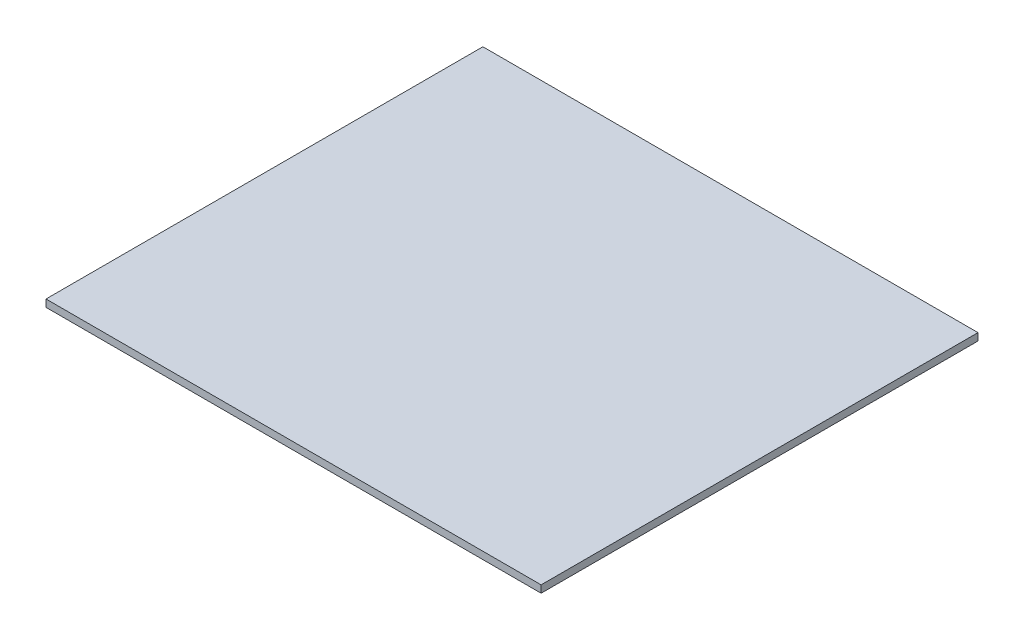
ISO-10303-21;
HEADER;
FILE_DESCRIPTION(('STEP AP214'),'2;1');
FILE_NAME('part.step','',(''),(''),'','','');
FILE_SCHEMA(('AUTOMOTIVE_DESIGN { 1 0 10303 214 1 1 1 1 }'));
ENDSEC;
DATA;
#1=APPLICATION_CONTEXT('core data for automotive mechanical design processes');
#2=APPLICATION_PROTOCOL_DEFINITION('international standard','automotive_design',2000,#1);
#3=PRODUCT_CONTEXT('',#1,'mechanical');
#4=PRODUCT('Part','Part','',(#3));
#5=PRODUCT_RELATED_PRODUCT_CATEGORY('part','',(#4));
#6=PRODUCT_DEFINITION_FORMATION('','',#4);
#7=PRODUCT_DEFINITION_CONTEXT('part definition',#1,'design');
#8=PRODUCT_DEFINITION('design','',#6,#7);
#9=PRODUCT_DEFINITION_SHAPE('','',#8);
#10=(LENGTH_UNIT() NAMED_UNIT(*) SI_UNIT(.MILLI.,.METRE.));
#11=(NAMED_UNIT(*) PLANE_ANGLE_UNIT() SI_UNIT($,.RADIAN.));
#12=(NAMED_UNIT(*) SI_UNIT($,.STERADIAN.) SOLID_ANGLE_UNIT());
#13=UNCERTAINTY_MEASURE_WITH_UNIT(LENGTH_MEASURE(1.E-05),#10,'distance_accuracy_value','');
#14=(GEOMETRIC_REPRESENTATION_CONTEXT(3) GLOBAL_UNCERTAINTY_ASSIGNED_CONTEXT((#13)) GLOBAL_UNIT_ASSIGNED_CONTEXT((#10,
#11,#12)) REPRESENTATION_CONTEXT('',''));
#15=CARTESIAN_POINT('',(0.,0.,0.));
#16=DIRECTION('',(0.,0.,1.));
#17=DIRECTION('',(1.,0.,0.));
#18=AXIS2_PLACEMENT_3D('',#15,#16,#17);
#19=CARTESIAN_POINT('',(0.,5.,0.));
#20=DIRECTION('',(1.,0.,0.));
#21=DIRECTION('',(0.,0.,-1.));
#22=AXIS2_PLACEMENT_3D('',#19,#20,#21);
#23=PLANE('',#22);
#24=DIRECTION('',(0.,0.,1.));
#25=VECTOR('',#24,1.);
#26=CARTESIAN_POINT('',(0.,0.,0.));
#27=LINE('',#26,#25);
#28=CARTESIAN_POINT('',(0.,0.,-300.));
#29=VERTEX_POINT('',#28);
#30=CARTESIAN_POINT('',(0.,0.,0.));
#31=VERTEX_POINT('',#30);
#32=EDGE_CURVE('E98',#29,#31,#27,.T.);
#33=ORIENTED_EDGE('',*,*,#32,.T.);
#34=DIRECTION('',(0.,-1.,0.));
#35=VECTOR('',#34,1.);
#36=CARTESIAN_POINT('',(0.,5.,0.));
#37=LINE('',#36,#35);
#38=CARTESIAN_POINT('',(0.,5.,0.));
#39=VERTEX_POINT('',#38);
#40=EDGE_CURVE('E11',#39,#31,#37,.T.);
#41=ORIENTED_EDGE('',*,*,#40,.F.);
#42=DIRECTION('',(0.,0.,1.));
#43=VECTOR('',#42,1.);
#44=CARTESIAN_POINT('',(0.,5.,0.));
#45=LINE('',#44,#43);
#46=CARTESIAN_POINT('',(0.,5.,-300.));
#47=VERTEX_POINT('',#46);
#48=EDGE_CURVE('E86',#47,#39,#45,.T.);
#49=ORIENTED_EDGE('',*,*,#48,.F.);
#50=DIRECTION('',(0.,-1.,0.));
#51=VECTOR('',#50,1.);
#52=CARTESIAN_POINT('',(0.,5.,-300.));
#53=LINE('',#52,#51);
#54=EDGE_CURVE('E94',#47,#29,#53,.T.);
#55=ORIENTED_EDGE('',*,*,#54,.T.);
#56=EDGE_LOOP('',(#33,#41,#49,#55));
#57=FACE_BOUND('',#56,.T.);
#58=ADVANCED_FACE('F35',(#57),#23,.F.);
#59=CARTESIAN_POINT('',(0.,5.,0.));
#60=DIRECTION('',(0.,0.,-1.));
#61=DIRECTION('',(-1.,0.,0.));
#62=AXIS2_PLACEMENT_3D('',#59,#60,#61);
#63=PLANE('',#62);
#64=DIRECTION('',(1.,0.,0.));
#65=VECTOR('',#64,1.);
#66=CARTESIAN_POINT('',(0.,0.,0.));
#67=LINE('',#66,#65);
#68=CARTESIAN_POINT('',(340.,0.,0.));
#69=VERTEX_POINT('',#68);
#70=EDGE_CURVE('E90',#31,#69,#67,.T.);
#71=ORIENTED_EDGE('',*,*,#70,.T.);
#72=DIRECTION('',(0.,-1.,0.));
#73=VECTOR('',#72,1.);
#74=CARTESIAN_POINT('',(340.,5.,0.));
#75=LINE('',#74,#73);
#76=CARTESIAN_POINT('',(340.,5.,0.));
#77=VERTEX_POINT('',#76);
#78=EDGE_CURVE('E43',#77,#69,#75,.T.);
#79=ORIENTED_EDGE('',*,*,#78,.F.);
#80=DIRECTION('',(1.,0.,0.));
#81=VECTOR('',#80,1.);
#82=CARTESIAN_POINT('',(0.,5.,0.));
#83=LINE('',#82,#81);
#84=EDGE_CURVE('E81',#39,#77,#83,.T.);
#85=ORIENTED_EDGE('',*,*,#84,.F.);
#86=ORIENTED_EDGE('',*,*,#40,.T.);
#87=EDGE_LOOP('',(#71,#79,#85,#86));
#88=FACE_BOUND('',#87,.T.);
#89=ADVANCED_FACE('F89',(#88),#63,.F.);
#90=CARTESIAN_POINT('',(340.,5.,0.));
#91=DIRECTION('',(-1.,0.,0.));
#92=DIRECTION('',(0.,0.,1.));
#93=AXIS2_PLACEMENT_3D('',#90,#91,#92);
#94=PLANE('',#93);
#95=DIRECTION('',(0.,0.,-1.));
#96=VECTOR('',#95,1.);
#97=CARTESIAN_POINT('',(340.,0.,0.));
#98=LINE('',#97,#96);
#99=CARTESIAN_POINT('',(340.,0.,-300.));
#100=VERTEX_POINT('',#99);
#101=EDGE_CURVE('E68',#69,#100,#98,.T.);
#102=ORIENTED_EDGE('',*,*,#101,.T.);
#103=DIRECTION('',(0.,-1.,0.));
#104=VECTOR('',#103,1.);
#105=CARTESIAN_POINT('',(340.,5.,-300.));
#106=LINE('',#105,#104);
#107=CARTESIAN_POINT('',(340.,5.,-300.));
#108=VERTEX_POINT('',#107);
#109=EDGE_CURVE('E91',#108,#100,#106,.T.);
#110=ORIENTED_EDGE('',*,*,#109,.F.);
#111=DIRECTION('',(0.,0.,-1.));
#112=VECTOR('',#111,1.);
#113=CARTESIAN_POINT('',(340.,5.,0.));
#114=LINE('',#113,#112);
#115=EDGE_CURVE('E84',#77,#108,#114,.T.);
#116=ORIENTED_EDGE('',*,*,#115,.F.);
#117=ORIENTED_EDGE('',*,*,#78,.T.);
#118=EDGE_LOOP('',(#102,#110,#116,#117));
#119=FACE_BOUND('',#118,.T.);
#120=ADVANCED_FACE('F92',(#119),#94,.F.);
#121=CARTESIAN_POINT('',(0.,5.,-300.));
#122=DIRECTION('',(0.,0.,1.));
#123=DIRECTION('',(1.,0.,0.));
#124=AXIS2_PLACEMENT_3D('',#121,#122,#123);
#125=PLANE('',#124);
#126=DIRECTION('',(-1.,0.,0.));
#127=VECTOR('',#126,1.);
#128=CARTESIAN_POINT('',(0.,0.,-300.));
#129=LINE('',#128,#127);
#130=EDGE_CURVE('E74',#100,#29,#129,.T.);
#131=ORIENTED_EDGE('',*,*,#130,.T.);
#132=ORIENTED_EDGE('',*,*,#54,.F.);
#133=DIRECTION('',(-1.,0.,0.));
#134=VECTOR('',#133,1.);
#135=CARTESIAN_POINT('',(0.,5.,-300.));
#136=LINE('',#135,#134);
#137=EDGE_CURVE('E51',#108,#47,#136,.T.);
#138=ORIENTED_EDGE('',*,*,#137,.F.);
#139=ORIENTED_EDGE('',*,*,#109,.T.);
#140=EDGE_LOOP('',(#131,#132,#138,#139));
#141=FACE_BOUND('',#140,.T.);
#142=ADVANCED_FACE('F105',(#141),#125,.F.);
#143=CARTESIAN_POINT('',(0.,5.,0.));
#144=DIRECTION('',(0.,-1.,0.));
#145=DIRECTION('',(0.,0.,-1.));
#146=AXIS2_PLACEMENT_3D('',#143,#144,#145);
#147=PLANE('',#146);
#148=ORIENTED_EDGE('',*,*,#48,.T.);
#149=ORIENTED_EDGE('',*,*,#84,.T.);
#150=ORIENTED_EDGE('',*,*,#115,.T.);
#151=ORIENTED_EDGE('',*,*,#137,.T.);
#152=EDGE_LOOP('',(#148,#149,#150,#151));
#153=FACE_BOUND('',#152,.T.);
#154=ADVANCED_FACE('F82',(#153),#147,.F.);
#155=CARTESIAN_POINT('',(0.,0.,0.));
#156=DIRECTION('',(0.,-1.,0.));
#157=DIRECTION('',(0.,0.,-1.));
#158=AXIS2_PLACEMENT_3D('',#155,#156,#157);
#159=PLANE('',#158);
#160=ORIENTED_EDGE('',*,*,#32,.F.);
#161=ORIENTED_EDGE('',*,*,#130,.F.);
#162=ORIENTED_EDGE('',*,*,#101,.F.);
#163=ORIENTED_EDGE('',*,*,#70,.F.);
#164=EDGE_LOOP('',(#160,#161,#162,#163));
#165=FACE_BOUND('',#164,.T.);
#166=ADVANCED_FACE('F108',(#165),#159,.T.);
#167=CLOSED_SHELL('',(#58,#89,#120,#142,#154,#166));
#168=MANIFOLD_SOLID_BREP('B2',#167);
#169=ADVANCED_BREP_SHAPE_REPRESENTATION('',(#18,#168),#14);
#170=SHAPE_DEFINITION_REPRESENTATION(#9,#169);
ENDSEC;
END-ISO-10303-21;
